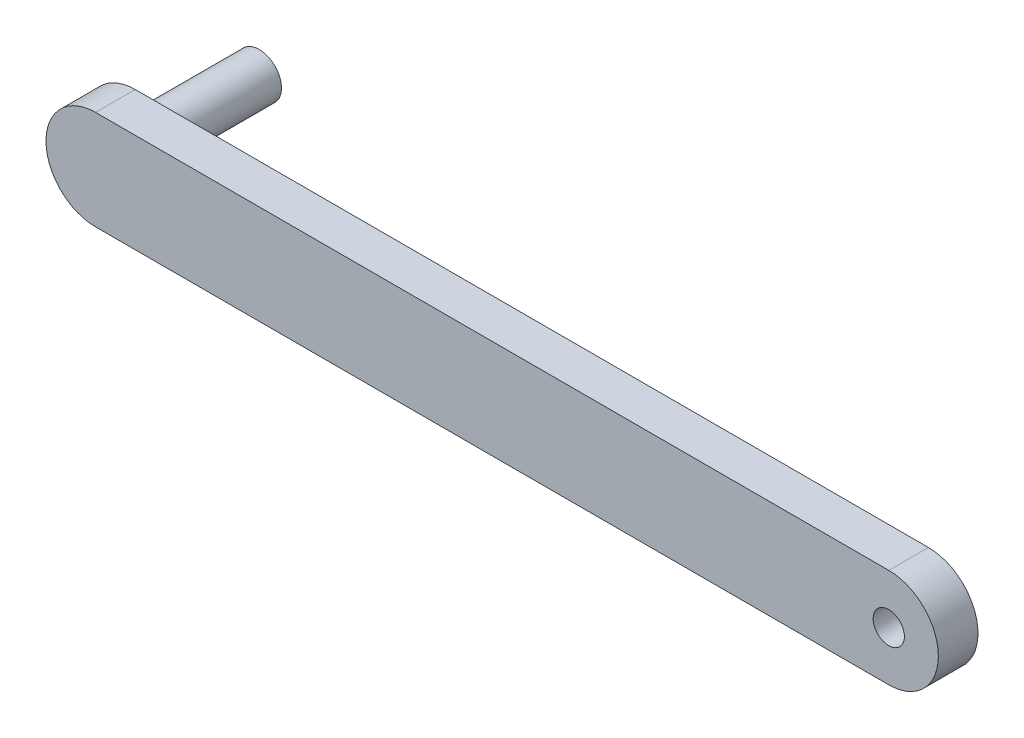
ISO-10303-21;
HEADER;
FILE_DESCRIPTION(('STEP AP214'),'2;1');
FILE_NAME('part.step','',(''),(''),'','','');
FILE_SCHEMA(('AUTOMOTIVE_DESIGN { 1 0 10303 214 1 1 1 1 }'));
ENDSEC;
DATA;
#1=APPLICATION_CONTEXT('core data for automotive mechanical design processes');
#2=APPLICATION_PROTOCOL_DEFINITION('international standard','automotive_design',2000,#1);
#3=PRODUCT_CONTEXT('',#1,'mechanical');
#4=PRODUCT('Part','Part','',(#3));
#5=PRODUCT_RELATED_PRODUCT_CATEGORY('part','',(#4));
#6=PRODUCT_DEFINITION_FORMATION('','',#4);
#7=PRODUCT_DEFINITION_CONTEXT('part definition',#1,'design');
#8=PRODUCT_DEFINITION('design','',#6,#7);
#9=PRODUCT_DEFINITION_SHAPE('','',#8);
#10=(LENGTH_UNIT() NAMED_UNIT(*) SI_UNIT(.MILLI.,.METRE.));
#11=(NAMED_UNIT(*) PLANE_ANGLE_UNIT() SI_UNIT($,.RADIAN.));
#12=(NAMED_UNIT(*) SI_UNIT($,.STERADIAN.) SOLID_ANGLE_UNIT());
#13=UNCERTAINTY_MEASURE_WITH_UNIT(LENGTH_MEASURE(1.E-05),#10,'distance_accuracy_value','');
#14=(GEOMETRIC_REPRESENTATION_CONTEXT(3) GLOBAL_UNCERTAINTY_ASSIGNED_CONTEXT((#13)) GLOBAL_UNIT_ASSIGNED_CONTEXT((#10,
#11,#12)) REPRESENTATION_CONTEXT('',''));
#15=CARTESIAN_POINT('',(0.,0.,0.));
#16=DIRECTION('',(0.,0.,1.));
#17=DIRECTION('',(1.,0.,0.));
#18=AXIS2_PLACEMENT_3D('',#15,#16,#17);
#19=CARTESIAN_POINT('',(-60.,0.,4.));
#20=DIRECTION('',(0.,0.,-1.));
#21=DIRECTION('',(-1.,0.,0.));
#22=AXIS2_PLACEMENT_3D('',#19,#20,#21);
#23=CYLINDRICAL_SURFACE('',#22,5.);
#24=CARTESIAN_POINT('',(-60.,0.,0.));
#25=DIRECTION('',(0.,0.,1.));
#26=DIRECTION('',(1.,0.,0.));
#27=AXIS2_PLACEMENT_3D('',#24,#25,#26);
#28=CIRCLE('',#27,5.);
#29=CARTESIAN_POINT('',(-60.,-5.,0.));
#30=VERTEX_POINT('',#29);
#31=CARTESIAN_POINT('',(-60.,5.,0.));
#32=VERTEX_POINT('',#31);
#33=EDGE_CURVE('E102',#30,#32,#28,.T.);
#34=ORIENTED_EDGE('',*,*,#33,.T.);
#35=DIRECTION('',(0.,0.,-1.));
#36=VECTOR('',#35,1.);
#37=CARTESIAN_POINT('',(-60.,5.,4.));
#38=LINE('',#37,#36);
#39=CARTESIAN_POINT('',(-60.,5.,4.));
#40=VERTEX_POINT('',#39);
#41=EDGE_CURVE('E93',#40,#32,#38,.T.);
#42=ORIENTED_EDGE('',*,*,#41,.F.);
#43=CARTESIAN_POINT('',(-60.,0.,4.));
#44=DIRECTION('',(0.,0.,1.));
#45=DIRECTION('',(1.,0.,0.));
#46=AXIS2_PLACEMENT_3D('',#43,#44,#45);
#47=CIRCLE('',#46,5.);
#48=CARTESIAN_POINT('',(-60.,-5.,4.));
#49=VERTEX_POINT('',#48);
#50=EDGE_CURVE('E87',#49,#40,#47,.T.);
#51=ORIENTED_EDGE('',*,*,#50,.F.);
#52=DIRECTION('',(0.,0.,-1.));
#53=VECTOR('',#52,1.);
#54=CARTESIAN_POINT('',(-60.,-5.,4.));
#55=LINE('',#54,#53);
#56=EDGE_CURVE('E98',#49,#30,#55,.T.);
#57=ORIENTED_EDGE('',*,*,#56,.T.);
#58=EDGE_LOOP('',(#34,#42,#51,#57));
#59=FACE_BOUND('',#58,.T.);
#60=ADVANCED_FACE('F33',(#59),#23,.T.);
#61=CARTESIAN_POINT('',(-60.,5.,4.));
#62=DIRECTION('',(0.,-1.,0.));
#63=DIRECTION('',(1.,0.,0.));
#64=AXIS2_PLACEMENT_3D('',#61,#62,#63);
#65=PLANE('',#64);
#66=DIRECTION('',(-1.,0.,0.));
#67=VECTOR('',#66,1.);
#68=CARTESIAN_POINT('',(-60.,5.,0.));
#69=LINE('',#68,#67);
#70=CARTESIAN_POINT('',(-140.,4.99999999999999,0.));
#71=VERTEX_POINT('',#70);
#72=EDGE_CURVE('E92',#32,#71,#69,.T.);
#73=ORIENTED_EDGE('',*,*,#72,.T.);
#74=DIRECTION('',(0.,0.,-1.));
#75=VECTOR('',#74,1.);
#76=CARTESIAN_POINT('',(-140.,4.99999999999999,4.));
#77=LINE('',#76,#75);
#78=CARTESIAN_POINT('',(-140.,4.99999999999999,4.));
#79=VERTEX_POINT('',#78);
#80=EDGE_CURVE('E90',#79,#71,#77,.T.);
#81=ORIENTED_EDGE('',*,*,#80,.F.);
#82=DIRECTION('',(-1.,0.,0.));
#83=VECTOR('',#82,1.);
#84=CARTESIAN_POINT('',(-60.,5.,4.));
#85=LINE('',#84,#83);
#86=EDGE_CURVE('E82',#40,#79,#85,.T.);
#87=ORIENTED_EDGE('',*,*,#86,.F.);
#88=ORIENTED_EDGE('',*,*,#41,.T.);
#89=EDGE_LOOP('',(#73,#81,#87,#88));
#90=FACE_BOUND('',#89,.T.);
#91=ADVANCED_FACE('F91',(#90),#65,.F.);
#92=CARTESIAN_POINT('',(-140.,0.,4.));
#93=DIRECTION('',(0.,0.,-1.));
#94=DIRECTION('',(-1.,0.,0.));
#95=AXIS2_PLACEMENT_3D('',#92,#93,#94);
#96=CYLINDRICAL_SURFACE('',#95,5.);
#97=CARTESIAN_POINT('',(-140.,0.,0.));
#98=DIRECTION('',(0.,0.,1.));
#99=DIRECTION('',(1.,0.,0.));
#100=AXIS2_PLACEMENT_3D('',#97,#98,#99);
#101=CIRCLE('',#100,5.);
#102=CARTESIAN_POINT('',(-140.,-5.00000000000001,0.));
#103=VERTEX_POINT('',#102);
#104=EDGE_CURVE('E68',#71,#103,#101,.T.);
#105=ORIENTED_EDGE('',*,*,#104,.T.);
#106=DIRECTION('',(0.,0.,-1.));
#107=VECTOR('',#106,1.);
#108=CARTESIAN_POINT('',(-140.,-5.00000000000001,4.));
#109=LINE('',#108,#107);
#110=CARTESIAN_POINT('',(-140.,-5.00000000000001,4.));
#111=VERTEX_POINT('',#110);
#112=EDGE_CURVE('E94',#111,#103,#109,.T.);
#113=ORIENTED_EDGE('',*,*,#112,.F.);
#114=CARTESIAN_POINT('',(-140.,0.,4.));
#115=DIRECTION('',(0.,0.,1.));
#116=DIRECTION('',(1.,0.,0.));
#117=AXIS2_PLACEMENT_3D('',#114,#115,#116);
#118=CIRCLE('',#117,5.);
#119=EDGE_CURVE('E85',#79,#111,#118,.T.);
#120=ORIENTED_EDGE('',*,*,#119,.F.);
#121=ORIENTED_EDGE('',*,*,#80,.T.);
#122=EDGE_LOOP('',(#105,#113,#120,#121));
#123=FACE_BOUND('',#122,.T.);
#124=ADVANCED_FACE('F96',(#123),#96,.T.);
#125=CARTESIAN_POINT('',(-60.,-5.,4.));
#126=DIRECTION('',(0.,1.,0.));
#127=DIRECTION('',(-1.,0.,0.));
#128=AXIS2_PLACEMENT_3D('',#125,#126,#127);
#129=PLANE('',#128);
#130=DIRECTION('',(1.,0.,0.));
#131=VECTOR('',#130,1.);
#132=CARTESIAN_POINT('',(-60.,-5.,0.));
#133=LINE('',#132,#131);
#134=EDGE_CURVE('E74',#103,#30,#133,.T.);
#135=ORIENTED_EDGE('',*,*,#134,.T.);
#136=ORIENTED_EDGE('',*,*,#56,.F.);
#137=DIRECTION('',(1.,0.,0.));
#138=VECTOR('',#137,1.);
#139=CARTESIAN_POINT('',(-60.,-5.,4.));
#140=LINE('',#139,#138);
#141=EDGE_CURVE('E51',#111,#49,#140,.T.);
#142=ORIENTED_EDGE('',*,*,#141,.F.);
#143=ORIENTED_EDGE('',*,*,#112,.T.);
#144=EDGE_LOOP('',(#135,#136,#142,#143));
#145=FACE_BOUND('',#144,.T.);
#146=ADVANCED_FACE('F140',(#145),#129,.F.);
#147=CARTESIAN_POINT('',(-60.,0.,4.));
#148=DIRECTION('',(0.,0.,1.));
#149=DIRECTION('',(1.,0.,0.));
#150=AXIS2_PLACEMENT_3D('',#147,#148,#149);
#151=PLANE('',#150);
#152=CARTESIAN_POINT('',(-60.,0.,4.));
#153=DIRECTION('',(0.,0.,1.));
#154=DIRECTION('',(1.,0.,0.));
#155=AXIS2_PLACEMENT_3D('',#152,#153,#154);
#156=CIRCLE('',#155,1.575);
#157=CARTESIAN_POINT('',(-58.425,0.,4.));
#158=VERTEX_POINT('',#157);
#159=EDGE_CURVE('E209',#158,#158,#156,.T.);
#160=ORIENTED_EDGE('',*,*,#159,.F.);
#161=EDGE_LOOP('',(#160));
#162=FACE_BOUND('',#161,.T.);
#163=ORIENTED_EDGE('',*,*,#50,.T.);
#164=ORIENTED_EDGE('',*,*,#86,.T.);
#165=ORIENTED_EDGE('',*,*,#119,.T.);
#166=ORIENTED_EDGE('',*,*,#141,.T.);
#167=EDGE_LOOP('',(#163,#164,#165,#166));
#168=FACE_BOUND('',#167,.T.);
#169=ADVANCED_FACE('F83',(#162,#168),#151,.T.);
#170=CARTESIAN_POINT('',(-60.,0.,0.));
#171=DIRECTION('',(0.,0.,1.));
#172=DIRECTION('',(1.,0.,0.));
#173=AXIS2_PLACEMENT_3D('',#170,#171,#172);
#174=PLANE('',#173);
#175=CARTESIAN_POINT('',(-60.,0.,0.));
#176=DIRECTION('',(0.,0.,1.));
#177=DIRECTION('',(1.,0.,0.));
#178=AXIS2_PLACEMENT_3D('',#175,#176,#177);
#179=CIRCLE('',#178,1.575);
#180=CARTESIAN_POINT('',(-58.425,0.,0.));
#181=VERTEX_POINT('',#180);
#182=EDGE_CURVE('E37',#181,#181,#179,.T.);
#183=ORIENTED_EDGE('',*,*,#182,.T.);
#184=EDGE_LOOP('',(#183));
#185=FACE_BOUND('',#184,.T.);
#186=CARTESIAN_POINT('',(-140.,0.,0.));
#187=DIRECTION('',(0.,0.,1.));
#188=DIRECTION('',(1.,0.,0.));
#189=AXIS2_PLACEMENT_3D('',#186,#187,#188);
#190=CIRCLE('',#189,4.75000000000001);
#191=CARTESIAN_POINT('',(-135.25,0.,0.));
#192=VERTEX_POINT('',#191);
#193=EDGE_CURVE('E11',#192,#192,#190,.T.);
#194=ORIENTED_EDGE('',*,*,#193,.T.);
#195=EDGE_LOOP('',(#194));
#196=FACE_BOUND('',#195,.T.);
#197=ORIENTED_EDGE('',*,*,#33,.F.);
#198=ORIENTED_EDGE('',*,*,#134,.F.);
#199=ORIENTED_EDGE('',*,*,#104,.F.);
#200=ORIENTED_EDGE('',*,*,#72,.F.);
#201=EDGE_LOOP('',(#197,#198,#199,#200));
#202=FACE_BOUND('',#201,.T.);
#203=ADVANCED_FACE('F143',(#185,#196,#202),#174,.F.);
#204=CARTESIAN_POINT('',(-140.,0.,-12.5));
#205=DIRECTION('',(0.,0.,1.));
#206=DIRECTION('',(1.,0.,0.));
#207=AXIS2_PLACEMENT_3D('',#204,#205,#206);
#208=CYLINDRICAL_SURFACE('',#207,2.25000000000001);
#209=CARTESIAN_POINT('',(-140.,0.,-2.5));
#210=DIRECTION('',(0.,0.,1.));
#211=DIRECTION('',(1.,0.,0.));
#212=AXIS2_PLACEMENT_3D('',#209,#210,#211);
#213=CIRCLE('',#212,2.25000000000001);
#214=CARTESIAN_POINT('',(-137.75,0.,-2.5));
#215=VERTEX_POINT('',#214);
#216=EDGE_CURVE('E43',#215,#215,#213,.F.);
#217=ORIENTED_EDGE('',*,*,#216,.T.);
#218=EDGE_LOOP('',(#217));
#219=FACE_BOUND('',#218,.T.);
#220=CARTESIAN_POINT('',(-140.,0.,-12.5));
#221=DIRECTION('',(0.,0.,-1.));
#222=DIRECTION('',(-1.,0.,0.));
#223=AXIS2_PLACEMENT_3D('',#220,#221,#222);
#224=CIRCLE('',#223,2.25000000000001);
#225=CARTESIAN_POINT('',(-142.25,0.,-12.5));
#226=VERTEX_POINT('',#225);
#227=EDGE_CURVE('E105',#226,#226,#224,.T.);
#228=ORIENTED_EDGE('',*,*,#227,.F.);
#229=EDGE_LOOP('',(#228));
#230=FACE_BOUND('',#229,.T.);
#231=ADVANCED_FACE('F115',(#219,#230),#208,.T.);
#232=CARTESIAN_POINT('',(-140.,0.,-12.5));
#233=DIRECTION('',(0.,0.,-1.));
#234=DIRECTION('',(-1.,0.,0.));
#235=AXIS2_PLACEMENT_3D('',#232,#233,#234);
#236=PLANE('',#235);
#237=ORIENTED_EDGE('',*,*,#227,.T.);
#238=EDGE_LOOP('',(#237));
#239=FACE_BOUND('',#238,.T.);
#240=ADVANCED_FACE('F120',(#239),#236,.T.);
#241=CARTESIAN_POINT('',(-140.,0.,-2.5));
#242=DIRECTION('',(0.,0.,1.));
#243=DIRECTION('',(1.,0.,0.));
#244=AXIS2_PLACEMENT_3D('',#241,#242,#243);
#245=TOROIDAL_SURFACE('',#244,4.75000000000001,2.5);
#246=ORIENTED_EDGE('',*,*,#193,.F.);
#247=EDGE_LOOP('',(#246));
#248=FACE_BOUND('',#247,.T.);
#249=ORIENTED_EDGE('',*,*,#216,.F.);
#250=EDGE_LOOP('',(#249));
#251=FACE_BOUND('',#250,.T.);
#252=ADVANCED_FACE('F35',(#248,#251),#245,.F.);
#253=CARTESIAN_POINT('',(-60.,0.,-12.5));
#254=DIRECTION('',(0.,0.,1.));
#255=DIRECTION('',(1.,0.,0.));
#256=AXIS2_PLACEMENT_3D('',#253,#254,#255);
#257=CYLINDRICAL_SURFACE('',#256,1.575);
#258=ORIENTED_EDGE('',*,*,#159,.T.);
#259=EDGE_LOOP('',(#258));
#260=FACE_BOUND('',#259,.T.);
#261=ORIENTED_EDGE('',*,*,#182,.F.);
#262=EDGE_LOOP('',(#261));
#263=FACE_BOUND('',#262,.T.);
#264=ADVANCED_FACE('F119',(#260,#263),#257,.F.);
#265=CLOSED_SHELL('',(#60,#91,#124,#146,#169,#203,#231,#240,#252,#264));
#266=MANIFOLD_SOLID_BREP('B2',#265);
#267=ADVANCED_BREP_SHAPE_REPRESENTATION('',(#18,#266),#14);
#268=SHAPE_DEFINITION_REPRESENTATION(#9,#267);
ENDSEC;
END-ISO-10303-21;
